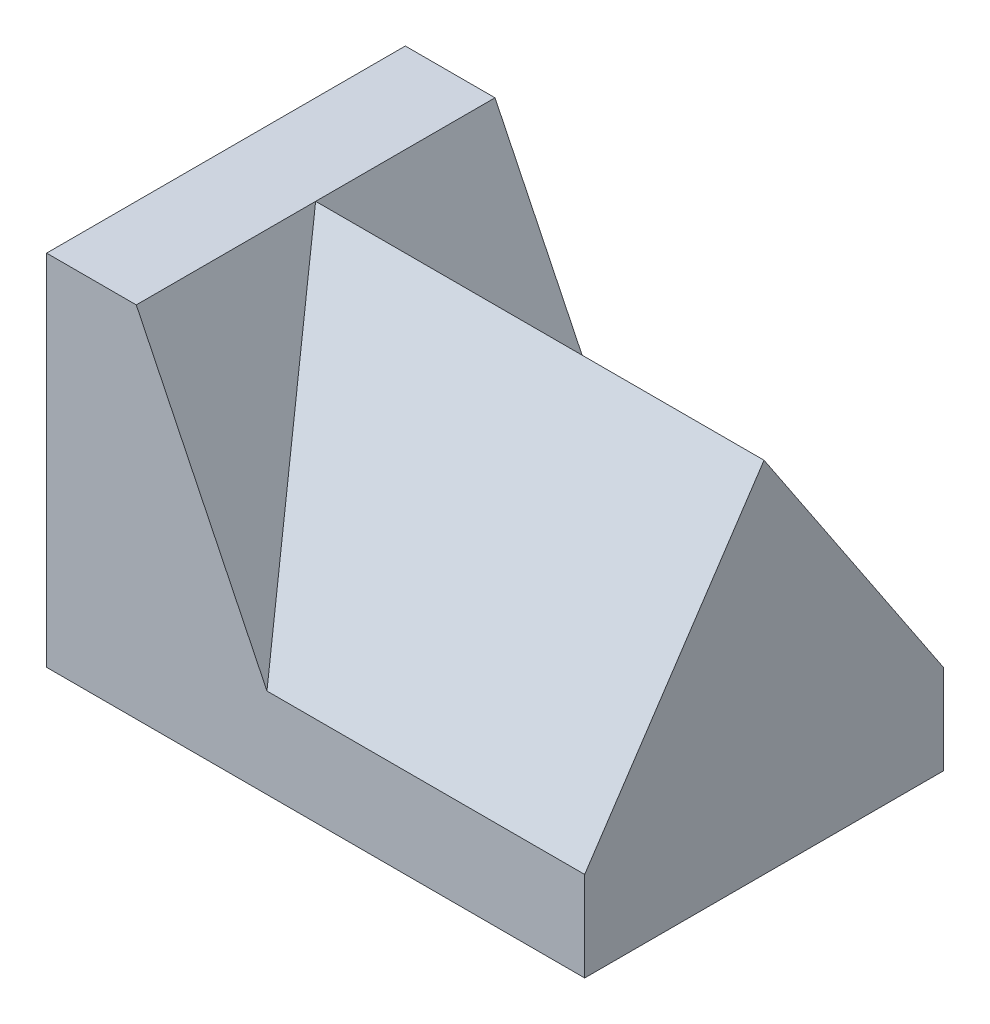
ISO-10303-21;
HEADER;
FILE_DESCRIPTION(('STEP AP214'),'2;1');
FILE_NAME('part.step','',(''),(''),'','','');
FILE_SCHEMA(('AUTOMOTIVE_DESIGN { 1 0 10303 214 1 1 1 1 }'));
ENDSEC;
DATA;
#1=APPLICATION_CONTEXT('core data for automotive mechanical design processes');
#2=APPLICATION_PROTOCOL_DEFINITION('international standard','automotive_design',2000,#1);
#3=PRODUCT_CONTEXT('',#1,'mechanical');
#4=PRODUCT('Part','Part','',(#3));
#5=PRODUCT_RELATED_PRODUCT_CATEGORY('part','',(#4));
#6=PRODUCT_DEFINITION_FORMATION('','',#4);
#7=PRODUCT_DEFINITION_CONTEXT('part definition',#1,'design');
#8=PRODUCT_DEFINITION('design','',#6,#7);
#9=PRODUCT_DEFINITION_SHAPE('','',#8);
#10=(LENGTH_UNIT() NAMED_UNIT(*) SI_UNIT(.MILLI.,.METRE.));
#11=(NAMED_UNIT(*) PLANE_ANGLE_UNIT() SI_UNIT($,.RADIAN.));
#12=(NAMED_UNIT(*) SI_UNIT($,.STERADIAN.) SOLID_ANGLE_UNIT());
#13=UNCERTAINTY_MEASURE_WITH_UNIT(LENGTH_MEASURE(1.E-05),#10,'distance_accuracy_value','');
#14=(GEOMETRIC_REPRESENTATION_CONTEXT(3) GLOBAL_UNCERTAINTY_ASSIGNED_CONTEXT((#13)) GLOBAL_UNIT_ASSIGNED_CONTEXT((#10,
#11,#12)) REPRESENTATION_CONTEXT('',''));
#15=CARTESIAN_POINT('',(0.,0.,0.));
#16=DIRECTION('',(0.,0.,1.));
#17=DIRECTION('',(1.,0.,0.));
#18=AXIS2_PLACEMENT_3D('',#15,#16,#17);
#19=CARTESIAN_POINT('',(-2.71461050313349,-5.,20.));
#20=DIRECTION('',(-0.899515812813078,-0.43688820366225,0.));
#21=DIRECTION('',(0.43688820366225,-0.899515812813078,0.));
#22=AXIS2_PLACEMENT_3D('',#19,#20,#21);
#23=PLANE('',#22);
#24=DIRECTION('',(-0.374681891109886,0.771438283301885,0.514292188867923));
#25=VECTOR('',#24,1.);
#26=CARTESIAN_POINT('',(-6.56852990129501,2.9348936659168,5.2899291106112));
#27=LINE('',#26,#25);
#28=CARTESIAN_POINT('',(-2.71461050313349,-5.,0.));
#29=VERTEX_POINT('',#28);
#30=CARTESIAN_POINT('',(-10.,10.,10.));
#31=VERTEX_POINT('',#30);
#32=EDGE_CURVE('E121',#29,#31,#27,.T.);
#33=ORIENTED_EDGE('',*,*,#32,.F.);
#34=DIRECTION('',(-0.43688820366225,0.899515812813078,0.));
#35=VECTOR('',#34,1.);
#36=CARTESIAN_POINT('',(-2.71461050313349,-5.,0.));
#37=LINE('',#36,#35);
#38=CARTESIAN_POINT('',(-10.,10.,0.));
#39=VERTEX_POINT('',#38);
#40=EDGE_CURVE('E118',#29,#39,#37,.T.);
#41=ORIENTED_EDGE('',*,*,#40,.T.);
#42=DIRECTION('',(0.,0.,-1.));
#43=VECTOR('',#42,1.);
#44=CARTESIAN_POINT('',(-10.,10.,20.));
#45=LINE('',#44,#43);
#46=EDGE_CURVE('E137',#31,#39,#45,.T.);
#47=ORIENTED_EDGE('',*,*,#46,.F.);
#48=EDGE_LOOP('',(#33,#41,#47));
#49=FACE_BOUND('',#48,.T.);
#50=ADVANCED_FACE('F33',(#49),#23,.F.);
#51=DIRECTION('',(0.374681891109886,-0.771438283301885,0.514292188867923));
#52=VECTOR('',#51,1.);
#53=CARTESIAN_POINT('',(-2.71461050313349,-5.,20.));
#54=LINE('',#53,#52);
#55=CARTESIAN_POINT('',(-2.71461050313349,-5.,20.));
#56=VERTEX_POINT('',#55);
#57=EDGE_CURVE('E48',#31,#56,#54,.T.);
#58=ORIENTED_EDGE('',*,*,#57,.F.);
#59=CARTESIAN_POINT('',(-10.,10.,20.));
#60=VERTEX_POINT('',#59);
#61=EDGE_CURVE('E110',#60,#31,#45,.T.);
#62=ORIENTED_EDGE('',*,*,#61,.F.);
#63=DIRECTION('',(-0.43688820366225,0.899515812813078,0.));
#64=VECTOR('',#63,1.);
#65=CARTESIAN_POINT('',(-2.71461050313349,-5.,20.));
#66=LINE('',#65,#64);
#67=EDGE_CURVE('E136',#56,#60,#66,.T.);
#68=ORIENTED_EDGE('',*,*,#67,.F.);
#69=EDGE_LOOP('',(#58,#62,#68));
#70=FACE_BOUND('',#69,.T.);
#71=ADVANCED_FACE('F166',(#70),#23,.F.);
#72=CARTESIAN_POINT('',(15.,10.,20.));
#73=DIRECTION('',(-1.,0.,0.));
#74=DIRECTION('',(0.,-1.,0.));
#75=AXIS2_PLACEMENT_3D('',#72,#73,#74);
#76=PLANE('',#75);
#77=DIRECTION('',(0.,1.,0.));
#78=VECTOR('',#77,1.);
#79=CARTESIAN_POINT('',(15.,10.,0.));
#80=LINE('',#79,#78);
#81=CARTESIAN_POINT('',(15.,-10.,0.));
#82=VERTEX_POINT('',#81);
#83=CARTESIAN_POINT('',(15.,-4.99999999999999,0.));
#84=VERTEX_POINT('',#83);
#85=EDGE_CURVE('E100',#82,#84,#80,.T.);
#86=ORIENTED_EDGE('',*,*,#85,.T.);
#87=DIRECTION('',(0.,0.832050294337844,0.554700196225229));
#88=VECTOR('',#87,1.);
#89=CARTESIAN_POINT('',(15.,-1.53846153846154,2.30769230769231));
#90=LINE('',#89,#88);
#91=CARTESIAN_POINT('',(15.,10.,10.));
#92=VERTEX_POINT('',#91);
#93=EDGE_CURVE('E104',#84,#92,#90,.T.);
#94=ORIENTED_EDGE('',*,*,#93,.T.);
#95=DIRECTION('',(0.,-0.832050294337844,0.554700196225229));
#96=VECTOR('',#95,1.);
#97=CARTESIAN_POINT('',(15.,7.69230769230769,11.5384615384615));
#98=LINE('',#97,#96);
#99=CARTESIAN_POINT('',(15.,-5.,20.));
#100=VERTEX_POINT('',#99);
#101=EDGE_CURVE('E126',#92,#100,#98,.T.);
#102=ORIENTED_EDGE('',*,*,#101,.T.);
#103=DIRECTION('',(0.,1.,0.));
#104=VECTOR('',#103,1.);
#105=CARTESIAN_POINT('',(15.,10.,20.));
#106=LINE('',#105,#104);
#107=CARTESIAN_POINT('',(15.,-10.,20.));
#108=VERTEX_POINT('',#107);
#109=EDGE_CURVE('E142',#108,#100,#106,.T.);
#110=ORIENTED_EDGE('',*,*,#109,.F.);
#111=DIRECTION('',(0.,0.,-1.));
#112=VECTOR('',#111,1.);
#113=CARTESIAN_POINT('',(15.,-10.,20.));
#114=LINE('',#113,#112);
#115=EDGE_CURVE('E107',#108,#82,#114,.T.);
#116=ORIENTED_EDGE('',*,*,#115,.T.);
#117=EDGE_LOOP('',(#86,#94,#102,#110,#116));
#118=FACE_BOUND('',#117,.T.);
#119=ADVANCED_FACE('F35',(#118),#76,.F.);
#120=CARTESIAN_POINT('',(-15.,10.,20.));
#121=DIRECTION('',(0.,-1.,0.));
#122=DIRECTION('',(0.,0.,-1.));
#123=AXIS2_PLACEMENT_3D('',#120,#121,#122);
#124=PLANE('',#123);
#125=DIRECTION('',(-1.,0.,0.));
#126=VECTOR('',#125,1.);
#127=CARTESIAN_POINT('',(-15.,10.,0.));
#128=LINE('',#127,#126);
#129=CARTESIAN_POINT('',(-15.,10.,0.));
#130=VERTEX_POINT('',#129);
#131=EDGE_CURVE('E109',#39,#130,#128,.T.);
#132=ORIENTED_EDGE('',*,*,#131,.T.);
#133=DIRECTION('',(0.,0.,-1.));
#134=VECTOR('',#133,1.);
#135=CARTESIAN_POINT('',(-15.,10.,20.));
#136=LINE('',#135,#134);
#137=CARTESIAN_POINT('',(-15.,10.,20.));
#138=VERTEX_POINT('',#137);
#139=EDGE_CURVE('E11',#138,#130,#136,.T.);
#140=ORIENTED_EDGE('',*,*,#139,.F.);
#141=DIRECTION('',(-1.,0.,0.));
#142=VECTOR('',#141,1.);
#143=CARTESIAN_POINT('',(-15.,10.,20.));
#144=LINE('',#143,#142);
#145=EDGE_CURVE('E78',#60,#138,#144,.T.);
#146=ORIENTED_EDGE('',*,*,#145,.F.);
#147=ORIENTED_EDGE('',*,*,#61,.T.);
#148=ORIENTED_EDGE('',*,*,#46,.T.);
#149=EDGE_LOOP('',(#132,#140,#146,#147,#148));
#150=FACE_BOUND('',#149,.T.);
#151=ADVANCED_FACE('F160',(#150),#124,.F.);
#152=CARTESIAN_POINT('',(-15.,10.,20.));
#153=DIRECTION('',(1.,0.,0.));
#154=DIRECTION('',(0.,1.,0.));
#155=AXIS2_PLACEMENT_3D('',#152,#153,#154);
#156=PLANE('',#155);
#157=DIRECTION('',(0.,0.,-1.));
#158=VECTOR('',#157,1.);
#159=CARTESIAN_POINT('',(-15.,-10.,20.));
#160=LINE('',#159,#158);
#161=CARTESIAN_POINT('',(-15.,-10.,20.));
#162=VERTEX_POINT('',#161);
#163=CARTESIAN_POINT('',(-15.,-10.,0.));
#164=VERTEX_POINT('',#163);
#165=EDGE_CURVE('E41',#162,#164,#160,.T.);
#166=ORIENTED_EDGE('',*,*,#165,.F.);
#167=DIRECTION('',(0.,-1.,0.));
#168=VECTOR('',#167,1.);
#169=CARTESIAN_POINT('',(-15.,10.,20.));
#170=LINE('',#169,#168);
#171=EDGE_CURVE('E145',#138,#162,#170,.T.);
#172=ORIENTED_EDGE('',*,*,#171,.F.);
#173=ORIENTED_EDGE('',*,*,#139,.T.);
#174=DIRECTION('',(0.,-1.,0.));
#175=VECTOR('',#174,1.);
#176=CARTESIAN_POINT('',(-15.,10.,0.));
#177=LINE('',#176,#175);
#178=EDGE_CURVE('E150',#130,#164,#177,.T.);
#179=ORIENTED_EDGE('',*,*,#178,.T.);
#180=EDGE_LOOP('',(#166,#172,#173,#179));
#181=FACE_BOUND('',#180,.T.);
#182=ADVANCED_FACE('F158',(#181),#156,.F.);
#183=CARTESIAN_POINT('',(-15.,-10.,20.));
#184=DIRECTION('',(0.,1.,0.));
#185=DIRECTION('',(0.,0.,1.));
#186=AXIS2_PLACEMENT_3D('',#183,#184,#185);
#187=PLANE('',#186);
#188=DIRECTION('',(1.,0.,0.));
#189=VECTOR('',#188,1.);
#190=CARTESIAN_POINT('',(-15.,-10.,0.));
#191=LINE('',#190,#189);
#192=EDGE_CURVE('E73',#164,#82,#191,.T.);
#193=ORIENTED_EDGE('',*,*,#192,.T.);
#194=ORIENTED_EDGE('',*,*,#115,.F.);
#195=DIRECTION('',(1.,0.,0.));
#196=VECTOR('',#195,1.);
#197=CARTESIAN_POINT('',(-15.,-10.,20.));
#198=LINE('',#197,#196);
#199=EDGE_CURVE('E57',#162,#108,#198,.T.);
#200=ORIENTED_EDGE('',*,*,#199,.F.);
#201=ORIENTED_EDGE('',*,*,#165,.T.);
#202=EDGE_LOOP('',(#193,#194,#200,#201));
#203=FACE_BOUND('',#202,.T.);
#204=ADVANCED_FACE('F154',(#203),#187,.F.);
#205=CARTESIAN_POINT('',(0.,0.,20.));
#206=DIRECTION('',(0.,0.,1.));
#207=DIRECTION('',(1.,0.,0.));
#208=AXIS2_PLACEMENT_3D('',#205,#206,#207);
#209=PLANE('',#208);
#210=DIRECTION('',(-1.,0.,0.));
#211=VECTOR('',#210,1.);
#212=CARTESIAN_POINT('',(15.,-5.,20.));
#213=LINE('',#212,#211);
#214=EDGE_CURVE('E133',#100,#56,#213,.T.);
#215=ORIENTED_EDGE('',*,*,#214,.T.);
#216=ORIENTED_EDGE('',*,*,#67,.T.);
#217=ORIENTED_EDGE('',*,*,#145,.T.);
#218=ORIENTED_EDGE('',*,*,#171,.T.);
#219=ORIENTED_EDGE('',*,*,#199,.T.);
#220=ORIENTED_EDGE('',*,*,#109,.T.);
#221=EDGE_LOOP('',(#215,#216,#217,#218,#219,#220));
#222=FACE_BOUND('',#221,.T.);
#223=ADVANCED_FACE('F165',(#222),#209,.T.);
#224=CARTESIAN_POINT('',(0.,0.,0.));
#225=DIRECTION('',(0.,0.,1.));
#226=DIRECTION('',(1.,0.,0.));
#227=AXIS2_PLACEMENT_3D('',#224,#225,#226);
#228=PLANE('',#227);
#229=ORIENTED_EDGE('',*,*,#192,.F.);
#230=ORIENTED_EDGE('',*,*,#178,.F.);
#231=ORIENTED_EDGE('',*,*,#131,.F.);
#232=ORIENTED_EDGE('',*,*,#40,.F.);
#233=DIRECTION('',(-1.,0.,0.));
#234=VECTOR('',#233,1.);
#235=CARTESIAN_POINT('',(15.,-5.,0.));
#236=LINE('',#235,#234);
#237=EDGE_CURVE('E114',#84,#29,#236,.T.);
#238=ORIENTED_EDGE('',*,*,#237,.F.);
#239=ORIENTED_EDGE('',*,*,#85,.F.);
#240=EDGE_LOOP('',(#229,#230,#231,#232,#238,#239));
#241=FACE_BOUND('',#240,.T.);
#242=ADVANCED_FACE('F115',(#241),#228,.F.);
#243=CARTESIAN_POINT('',(15.,-1.53846153846154,2.30769230769231));
#244=DIRECTION('',(0.,-0.554700196225229,0.832050294337844));
#245=DIRECTION('',(0.,-0.832050294337844,-0.554700196225229));
#246=AXIS2_PLACEMENT_3D('',#243,#244,#245);
#247=PLANE('',#246);
#248=ORIENTED_EDGE('',*,*,#237,.T.);
#249=ORIENTED_EDGE('',*,*,#32,.T.);
#250=DIRECTION('',(-1.,0.,0.));
#251=VECTOR('',#250,1.);
#252=CARTESIAN_POINT('',(15.,10.,10.));
#253=LINE('',#252,#251);
#254=EDGE_CURVE('E125',#92,#31,#253,.T.);
#255=ORIENTED_EDGE('',*,*,#254,.F.);
#256=ORIENTED_EDGE('',*,*,#93,.F.);
#257=EDGE_LOOP('',(#248,#249,#255,#256));
#258=FACE_BOUND('',#257,.T.);
#259=ADVANCED_FACE('F123',(#258),#247,.F.);
#260=CARTESIAN_POINT('',(15.,7.69230769230769,11.5384615384615));
#261=DIRECTION('',(0.,-0.554700196225229,-0.832050294337844));
#262=DIRECTION('',(0.,0.832050294337844,-0.554700196225229));
#263=AXIS2_PLACEMENT_3D('',#260,#261,#262);
#264=PLANE('',#263);
#265=ORIENTED_EDGE('',*,*,#254,.T.);
#266=ORIENTED_EDGE('',*,*,#57,.T.);
#267=ORIENTED_EDGE('',*,*,#214,.F.);
#268=ORIENTED_EDGE('',*,*,#101,.F.);
#269=EDGE_LOOP('',(#265,#266,#267,#268));
#270=FACE_BOUND('',#269,.T.);
#271=ADVANCED_FACE('F163',(#270),#264,.F.);
#272=CLOSED_SHELL('',(#50,#71,#119,#151,#182,#204,#223,#242,#259,#271));
#273=MANIFOLD_SOLID_BREP('B2',#272);
#274=ADVANCED_BREP_SHAPE_REPRESENTATION('',(#18,#273),#14);
#275=SHAPE_DEFINITION_REPRESENTATION(#9,#274);
ENDSEC;
END-ISO-10303-21;
